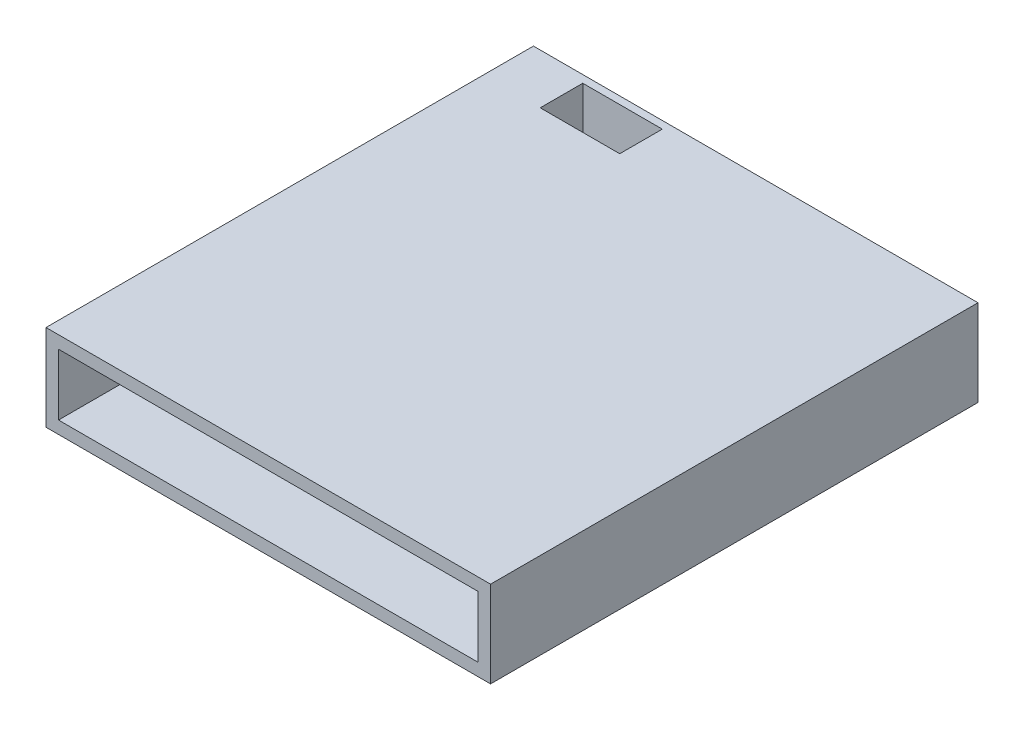
ISO-10303-21;
HEADER;
FILE_DESCRIPTION(('STEP AP214'),'2;1');
FILE_NAME('part.step','',(''),(''),'','','');
FILE_SCHEMA(('AUTOMOTIVE_DESIGN { 1 0 10303 214 1 1 1 1 }'));
ENDSEC;
DATA;
#1=APPLICATION_CONTEXT('core data for automotive mechanical design processes');
#2=APPLICATION_PROTOCOL_DEFINITION('international standard','automotive_design',2000,#1);
#3=PRODUCT_CONTEXT('',#1,'mechanical');
#4=PRODUCT('Part','Part','',(#3));
#5=PRODUCT_RELATED_PRODUCT_CATEGORY('part','',(#4));
#6=PRODUCT_DEFINITION_FORMATION('','',#4);
#7=PRODUCT_DEFINITION_CONTEXT('part definition',#1,'design');
#8=PRODUCT_DEFINITION('design','',#6,#7);
#9=PRODUCT_DEFINITION_SHAPE('','',#8);
#10=(LENGTH_UNIT() NAMED_UNIT(*) SI_UNIT(.MILLI.,.METRE.));
#11=(NAMED_UNIT(*) PLANE_ANGLE_UNIT() SI_UNIT($,.RADIAN.));
#12=(NAMED_UNIT(*) SI_UNIT($,.STERADIAN.) SOLID_ANGLE_UNIT());
#13=UNCERTAINTY_MEASURE_WITH_UNIT(LENGTH_MEASURE(1.E-05),#10,'distance_accuracy_value','');
#14=(GEOMETRIC_REPRESENTATION_CONTEXT(3) GLOBAL_UNCERTAINTY_ASSIGNED_CONTEXT((#13)) GLOBAL_UNIT_ASSIGNED_CONTEXT((#10,
#11,#12)) REPRESENTATION_CONTEXT('',''));
#15=CARTESIAN_POINT('',(0.,0.,0.));
#16=DIRECTION('',(0.,0.,1.));
#17=DIRECTION('',(1.,0.,0.));
#18=AXIS2_PLACEMENT_3D('',#15,#16,#17);
#19=CARTESIAN_POINT('',(-2.25,11.55,0.));
#20=DIRECTION('',(0.,0.,-1.));
#21=DIRECTION('',(-1.,0.,0.));
#22=AXIS2_PLACEMENT_3D('',#19,#20,#21);
#23=PLANE('',#22);
#24=DIRECTION('',(0.,-1.,0.));
#25=VECTOR('',#24,1.);
#26=CARTESIAN_POINT('',(6.83,11.9163239908033,0.));
#27=LINE('',#26,#25);
#28=CARTESIAN_POINT('',(6.83,9.55,0.));
#29=VERTEX_POINT('',#28);
#30=CARTESIAN_POINT('',(6.83,2.06,0.));
#31=VERTEX_POINT('',#30);
#32=EDGE_CURVE('E168',#29,#31,#27,.T.);
#33=ORIENTED_EDGE('',*,*,#32,.F.);
#34=DIRECTION('',(-1.,0.,0.));
#35=VECTOR('',#34,1.);
#36=CARTESIAN_POINT('',(-0.25,9.55,0.));
#37=LINE('',#36,#35);
#38=CARTESIAN_POINT('',(-0.25,9.55,0.));
#39=VERTEX_POINT('',#38);
#40=EDGE_CURVE('E216',#29,#39,#37,.T.);
#41=ORIENTED_EDGE('',*,*,#40,.T.);
#42=DIRECTION('',(0.,-1.,0.));
#43=VECTOR('',#42,1.);
#44=CARTESIAN_POINT('',(-0.25,-0.25,0.));
#45=LINE('',#44,#43);
#46=CARTESIAN_POINT('',(-0.25,-0.25,0.));
#47=VERTEX_POINT('',#46);
#48=EDGE_CURVE('E196',#39,#47,#45,.T.);
#49=ORIENTED_EDGE('',*,*,#48,.T.);
#50=DIRECTION('',(1.,0.,0.));
#51=VECTOR('',#50,1.);
#52=CARTESIAN_POINT('',(-0.25,-0.25,0.));
#53=LINE('',#52,#51);
#54=CARTESIAN_POINT('',(66.75,-0.25,0.));
#55=VERTEX_POINT('',#54);
#56=EDGE_CURVE('E210',#47,#55,#53,.T.);
#57=ORIENTED_EDGE('',*,*,#56,.T.);
#58=DIRECTION('',(0.,1.,0.));
#59=VECTOR('',#58,1.);
#60=CARTESIAN_POINT('',(66.75,-0.25,0.));
#61=LINE('',#60,#59);
#62=CARTESIAN_POINT('',(66.75,9.55,0.));
#63=VERTEX_POINT('',#62);
#64=EDGE_CURVE('E213',#55,#63,#61,.T.);
#65=ORIENTED_EDGE('',*,*,#64,.T.);
#66=CARTESIAN_POINT('',(19.5300000000045,9.55,0.));
#67=VERTEX_POINT('',#66);
#68=EDGE_CURVE('E200',#63,#67,#37,.T.);
#69=ORIENTED_EDGE('',*,*,#68,.T.);
#70=DIRECTION('',(0.,1.,0.));
#71=VECTOR('',#70,1.);
#72=CARTESIAN_POINT('',(19.5300000000045,11.9163239908033,0.));
#73=LINE('',#72,#71);
#74=CARTESIAN_POINT('',(19.5300000000045,2.06,0.));
#75=VERTEX_POINT('',#74);
#76=EDGE_CURVE('E163',#75,#67,#73,.T.);
#77=ORIENTED_EDGE('',*,*,#76,.F.);
#78=DIRECTION('',(1.,0.,0.));
#79=VECTOR('',#78,1.);
#80=CARTESIAN_POINT('',(6.83,2.06,0.));
#81=LINE('',#80,#79);
#82=EDGE_CURVE('E74',#31,#75,#81,.T.);
#83=ORIENTED_EDGE('',*,*,#82,.F.);
#84=EDGE_LOOP('',(#33,#41,#49,#57,#65,#69,#77,#83));
#85=FACE_BOUND('',#84,.T.);
#86=ADVANCED_FACE('F59',(#85),#23,.F.);
#87=CARTESIAN_POINT('',(0.,11.55,69.85));
#88=DIRECTION('',(0.,-1.,0.));
#89=DIRECTION('',(0.,0.,-1.));
#90=AXIS2_PLACEMENT_3D('',#87,#88,#89);
#91=PLANE('',#90);
#92=DIRECTION('',(0.,0.,-1.));
#93=VECTOR('',#92,1.);
#94=CARTESIAN_POINT('',(68.75,11.55,69.85));
#95=LINE('',#94,#93);
#96=CARTESIAN_POINT('',(68.75,11.55,69.85));
#97=VERTEX_POINT('',#96);
#98=CARTESIAN_POINT('',(68.75,11.55,-8.));
#99=VERTEX_POINT('',#98);
#100=EDGE_CURVE('E239',#97,#99,#95,.T.);
#101=ORIENTED_EDGE('',*,*,#100,.T.);
#102=DIRECTION('',(-1.,0.,0.));
#103=VECTOR('',#102,1.);
#104=CARTESIAN_POINT('',(-2.25,11.55,-8.));
#105=LINE('',#104,#103);
#106=CARTESIAN_POINT('',(-2.25,11.55,-8.));
#107=VERTEX_POINT('',#106);
#108=EDGE_CURVE('E187',#99,#107,#105,.T.);
#109=ORIENTED_EDGE('',*,*,#108,.T.);
#110=DIRECTION('',(0.,0.,-1.));
#111=VECTOR('',#110,1.);
#112=CARTESIAN_POINT('',(-2.25,11.55,69.85));
#113=LINE('',#112,#111);
#114=CARTESIAN_POINT('',(-2.25,11.55,69.85));
#115=VERTEX_POINT('',#114);
#116=EDGE_CURVE('E237',#115,#107,#113,.T.);
#117=ORIENTED_EDGE('',*,*,#116,.F.);
#118=DIRECTION('',(-1.,0.,0.));
#119=VECTOR('',#118,1.);
#120=CARTESIAN_POINT('',(0.,11.55,69.85));
#121=LINE('',#120,#119);
#122=EDGE_CURVE('E235',#97,#115,#121,.T.);
#123=ORIENTED_EDGE('',*,*,#122,.F.);
#124=EDGE_LOOP('',(#101,#109,#117,#123));
#125=FACE_BOUND('',#124,.T.);
#126=DIRECTION('',(-1.,0.,0.));
#127=VECTOR('',#126,1.);
#128=CARTESIAN_POINT('',(0.,11.55,-6.8));
#129=LINE('',#128,#127);
#130=CARTESIAN_POINT('',(19.5300000000045,11.55,-6.8));
#131=VERTEX_POINT('',#130);
#132=CARTESIAN_POINT('',(6.83,11.55,-6.8));
#133=VERTEX_POINT('',#132);
#134=EDGE_CURVE('E12',#131,#133,#129,.T.);
#135=ORIENTED_EDGE('',*,*,#134,.F.);
#136=DIRECTION('',(0.,0.,1.));
#137=VECTOR('',#136,1.);
#138=CARTESIAN_POINT('',(19.5300000000045,11.55,69.85));
#139=LINE('',#138,#137);
#140=CARTESIAN_POINT('',(19.5300000000045,11.55,0.));
#141=VERTEX_POINT('',#140);
#142=EDGE_CURVE('E248',#131,#141,#139,.T.);
#143=ORIENTED_EDGE('',*,*,#142,.T.);
#144=DIRECTION('',(-1.,0.,0.));
#145=VECTOR('',#144,1.);
#146=CARTESIAN_POINT('',(0.,11.55,0.));
#147=LINE('',#146,#145);
#148=CARTESIAN_POINT('',(6.83,11.55,0.));
#149=VERTEX_POINT('',#148);
#150=EDGE_CURVE('E245',#141,#149,#147,.T.);
#151=ORIENTED_EDGE('',*,*,#150,.T.);
#152=DIRECTION('',(0.,0.,-1.));
#153=VECTOR('',#152,1.);
#154=CARTESIAN_POINT('',(6.83,11.55,69.85));
#155=LINE('',#154,#153);
#156=EDGE_CURVE('E67',#149,#133,#155,.T.);
#157=ORIENTED_EDGE('',*,*,#156,.T.);
#158=EDGE_LOOP('',(#135,#143,#151,#157));
#159=FACE_BOUND('',#158,.T.);
#160=ADVANCED_FACE('F251',(#125,#159),#91,.F.);
#161=CARTESIAN_POINT('',(0.,0.,69.85));
#162=DIRECTION('',(0.,0.,1.));
#163=DIRECTION('',(1.,0.,0.));
#164=AXIS2_PLACEMENT_3D('',#161,#162,#163);
#165=PLANE('',#164);
#166=DIRECTION('',(0.,-1.,0.));
#167=VECTOR('',#166,1.);
#168=CARTESIAN_POINT('',(-2.25,0.,69.85));
#169=LINE('',#168,#167);
#170=CARTESIAN_POINT('',(-2.25,-2.25,69.85));
#171=VERTEX_POINT('',#170);
#172=EDGE_CURVE('E228',#115,#171,#169,.T.);
#173=ORIENTED_EDGE('',*,*,#172,.T.);
#174=DIRECTION('',(1.,0.,0.));
#175=VECTOR('',#174,1.);
#176=CARTESIAN_POINT('',(0.,-2.25,69.85));
#177=LINE('',#176,#175);
#178=CARTESIAN_POINT('',(68.75,-2.25,69.85));
#179=VERTEX_POINT('',#178);
#180=EDGE_CURVE('E231',#171,#179,#177,.T.);
#181=ORIENTED_EDGE('',*,*,#180,.T.);
#182=DIRECTION('',(0.,1.,0.));
#183=VECTOR('',#182,1.);
#184=CARTESIAN_POINT('',(68.75,0.,69.85));
#185=LINE('',#184,#183);
#186=EDGE_CURVE('E233',#179,#97,#185,.T.);
#187=ORIENTED_EDGE('',*,*,#186,.T.);
#188=ORIENTED_EDGE('',*,*,#122,.T.);
#189=EDGE_LOOP('',(#173,#181,#187,#188));
#190=FACE_BOUND('',#189,.T.);
#191=DIRECTION('',(1.,0.,0.));
#192=VECTOR('',#191,1.);
#193=CARTESIAN_POINT('',(-0.25,-0.25,69.85));
#194=LINE('',#193,#192);
#195=CARTESIAN_POINT('',(-0.25,-0.25,69.85));
#196=VERTEX_POINT('',#195);
#197=CARTESIAN_POINT('',(66.75,-0.25,69.85));
#198=VERTEX_POINT('',#197);
#199=EDGE_CURVE('E199',#196,#198,#194,.T.);
#200=ORIENTED_EDGE('',*,*,#199,.F.);
#201=DIRECTION('',(0.,-1.,0.));
#202=VECTOR('',#201,1.);
#203=CARTESIAN_POINT('',(-0.25,-0.25,69.85));
#204=LINE('',#203,#202);
#205=CARTESIAN_POINT('',(-0.25,9.55,69.85));
#206=VERTEX_POINT('',#205);
#207=EDGE_CURVE('E197',#206,#196,#204,.T.);
#208=ORIENTED_EDGE('',*,*,#207,.F.);
#209=DIRECTION('',(-1.,0.,0.));
#210=VECTOR('',#209,1.);
#211=CARTESIAN_POINT('',(-0.25,9.55,69.85));
#212=LINE('',#211,#210);
#213=CARTESIAN_POINT('',(66.75,9.55,69.85));
#214=VERTEX_POINT('',#213);
#215=EDGE_CURVE('E205',#214,#206,#212,.T.);
#216=ORIENTED_EDGE('',*,*,#215,.F.);
#217=DIRECTION('',(0.,1.,0.));
#218=VECTOR('',#217,1.);
#219=CARTESIAN_POINT('',(66.75,-0.25,69.85));
#220=LINE('',#219,#218);
#221=EDGE_CURVE('E202',#198,#214,#220,.T.);
#222=ORIENTED_EDGE('',*,*,#221,.F.);
#223=EDGE_LOOP('',(#200,#208,#216,#222));
#224=FACE_BOUND('',#223,.T.);
#225=ADVANCED_FACE('F274',(#190,#224),#165,.T.);
#226=CARTESIAN_POINT('',(-2.25,0.,69.85));
#227=DIRECTION('',(1.,0.,0.));
#228=DIRECTION('',(0.,0.,-1.));
#229=AXIS2_PLACEMENT_3D('',#226,#227,#228);
#230=PLANE('',#229);
#231=ORIENTED_EDGE('',*,*,#116,.T.);
#232=DIRECTION('',(0.,-1.,0.));
#233=VECTOR('',#232,1.);
#234=CARTESIAN_POINT('',(-2.25,11.55,-8.));
#235=LINE('',#234,#233);
#236=CARTESIAN_POINT('',(-2.25,-2.25,-8.));
#237=VERTEX_POINT('',#236);
#238=EDGE_CURVE('E190',#107,#237,#235,.T.);
#239=ORIENTED_EDGE('',*,*,#238,.T.);
#240=DIRECTION('',(0.,0.,-1.));
#241=VECTOR('',#240,1.);
#242=CARTESIAN_POINT('',(-2.25,-2.25,69.85));
#243=LINE('',#242,#241);
#244=EDGE_CURVE('E243',#171,#237,#243,.T.);
#245=ORIENTED_EDGE('',*,*,#244,.F.);
#246=ORIENTED_EDGE('',*,*,#172,.F.);
#247=EDGE_LOOP('',(#231,#239,#245,#246));
#248=FACE_BOUND('',#247,.T.);
#249=ADVANCED_FACE('F61',(#248),#230,.F.);
#250=CARTESIAN_POINT('',(0.,-2.25,69.85));
#251=DIRECTION('',(0.,1.,0.));
#252=DIRECTION('',(0.,0.,1.));
#253=AXIS2_PLACEMENT_3D('',#250,#251,#252);
#254=PLANE('',#253);
#255=ORIENTED_EDGE('',*,*,#244,.T.);
#256=DIRECTION('',(-1.,0.,0.));
#257=VECTOR('',#256,1.);
#258=CARTESIAN_POINT('',(-2.25,-2.25,-8.));
#259=LINE('',#258,#257);
#260=CARTESIAN_POINT('',(68.75,-2.25,-8.));
#261=VERTEX_POINT('',#260);
#262=EDGE_CURVE('E184',#261,#237,#259,.T.);
#263=ORIENTED_EDGE('',*,*,#262,.F.);
#264=DIRECTION('',(0.,0.,-1.));
#265=VECTOR('',#264,1.);
#266=CARTESIAN_POINT('',(68.75,-2.25,69.85));
#267=LINE('',#266,#265);
#268=EDGE_CURVE('E241',#179,#261,#267,.T.);
#269=ORIENTED_EDGE('',*,*,#268,.F.);
#270=ORIENTED_EDGE('',*,*,#180,.F.);
#271=EDGE_LOOP('',(#255,#263,#269,#270));
#272=FACE_BOUND('',#271,.T.);
#273=ADVANCED_FACE('F316',(#272),#254,.F.);
#274=CARTESIAN_POINT('',(68.75,0.,69.85));
#275=DIRECTION('',(-1.,0.,0.));
#276=DIRECTION('',(0.,0.,1.));
#277=AXIS2_PLACEMENT_3D('',#274,#275,#276);
#278=PLANE('',#277);
#279=ORIENTED_EDGE('',*,*,#268,.T.);
#280=DIRECTION('',(0.,-1.,0.));
#281=VECTOR('',#280,1.);
#282=CARTESIAN_POINT('',(68.75,11.55,-8.));
#283=LINE('',#282,#281);
#284=EDGE_CURVE('E193',#99,#261,#283,.T.);
#285=ORIENTED_EDGE('',*,*,#284,.F.);
#286=ORIENTED_EDGE('',*,*,#100,.F.);
#287=ORIENTED_EDGE('',*,*,#186,.F.);
#288=EDGE_LOOP('',(#279,#285,#286,#287));
#289=FACE_BOUND('',#288,.T.);
#290=ADVANCED_FACE('F287',(#289),#278,.F.);
#291=CARTESIAN_POINT('',(-0.25,-0.25,69.85));
#292=DIRECTION('',(1.,0.,0.));
#293=DIRECTION('',(0.,0.,-1.));
#294=AXIS2_PLACEMENT_3D('',#291,#292,#293);
#295=PLANE('',#294);
#296=ORIENTED_EDGE('',*,*,#48,.F.);
#297=DIRECTION('',(0.,0.,-1.));
#298=VECTOR('',#297,1.);
#299=CARTESIAN_POINT('',(-0.25,9.55,69.85));
#300=LINE('',#299,#298);
#301=EDGE_CURVE('E207',#206,#39,#300,.T.);
#302=ORIENTED_EDGE('',*,*,#301,.F.);
#303=ORIENTED_EDGE('',*,*,#207,.T.);
#304=DIRECTION('',(0.,0.,-1.));
#305=VECTOR('',#304,1.);
#306=CARTESIAN_POINT('',(-0.25,-0.25,69.85));
#307=LINE('',#306,#305);
#308=EDGE_CURVE('E225',#196,#47,#307,.T.);
#309=ORIENTED_EDGE('',*,*,#308,.T.);
#310=EDGE_LOOP('',(#296,#302,#303,#309));
#311=FACE_BOUND('',#310,.T.);
#312=ADVANCED_FACE('F277',(#311),#295,.T.);
#313=CARTESIAN_POINT('',(-0.25,-0.25,69.85));
#314=DIRECTION('',(0.,1.,0.));
#315=DIRECTION('',(0.,0.,1.));
#316=AXIS2_PLACEMENT_3D('',#313,#314,#315);
#317=PLANE('',#316);
#318=ORIENTED_EDGE('',*,*,#56,.F.);
#319=ORIENTED_EDGE('',*,*,#308,.F.);
#320=ORIENTED_EDGE('',*,*,#199,.T.);
#321=DIRECTION('',(0.,0.,-1.));
#322=VECTOR('',#321,1.);
#323=CARTESIAN_POINT('',(66.75,-0.25,69.85));
#324=LINE('',#323,#322);
#325=EDGE_CURVE('E223',#198,#55,#324,.T.);
#326=ORIENTED_EDGE('',*,*,#325,.T.);
#327=EDGE_LOOP('',(#318,#319,#320,#326));
#328=FACE_BOUND('',#327,.T.);
#329=ADVANCED_FACE('F279',(#328),#317,.T.);
#330=CARTESIAN_POINT('',(66.75,-0.25,69.85));
#331=DIRECTION('',(-1.,0.,0.));
#332=DIRECTION('',(0.,0.,1.));
#333=AXIS2_PLACEMENT_3D('',#330,#331,#332);
#334=PLANE('',#333);
#335=ORIENTED_EDGE('',*,*,#64,.F.);
#336=ORIENTED_EDGE('',*,*,#325,.F.);
#337=ORIENTED_EDGE('',*,*,#221,.T.);
#338=DIRECTION('',(0.,0.,-1.));
#339=VECTOR('',#338,1.);
#340=CARTESIAN_POINT('',(66.75,9.55,69.85));
#341=LINE('',#340,#339);
#342=EDGE_CURVE('E221',#214,#63,#341,.T.);
#343=ORIENTED_EDGE('',*,*,#342,.T.);
#344=EDGE_LOOP('',(#335,#336,#337,#343));
#345=FACE_BOUND('',#344,.T.);
#346=ADVANCED_FACE('F270',(#345),#334,.T.);
#347=CARTESIAN_POINT('',(-0.25,9.55,69.85));
#348=DIRECTION('',(0.,-1.,0.));
#349=DIRECTION('',(0.,0.,-1.));
#350=AXIS2_PLACEMENT_3D('',#347,#348,#349);
#351=PLANE('',#350);
#352=ORIENTED_EDGE('',*,*,#68,.F.);
#353=ORIENTED_EDGE('',*,*,#342,.F.);
#354=ORIENTED_EDGE('',*,*,#215,.T.);
#355=ORIENTED_EDGE('',*,*,#301,.T.);
#356=ORIENTED_EDGE('',*,*,#40,.F.);
#357=EDGE_CURVE('E182',#67,#29,#37,.T.);
#358=ORIENTED_EDGE('',*,*,#357,.F.);
#359=EDGE_LOOP('',(#352,#353,#354,#355,#356,#358));
#360=FACE_BOUND('',#359,.T.);
#361=ADVANCED_FACE('F258',(#360),#351,.T.);
#362=CARTESIAN_POINT('',(-2.25,11.55,-8.));
#363=DIRECTION('',(0.,0.,1.));
#364=DIRECTION('',(1.,0.,0.));
#365=AXIS2_PLACEMENT_3D('',#362,#363,#364);
#366=PLANE('',#365);
#367=ORIENTED_EDGE('',*,*,#284,.T.);
#368=ORIENTED_EDGE('',*,*,#262,.T.);
#369=ORIENTED_EDGE('',*,*,#238,.F.);
#370=ORIENTED_EDGE('',*,*,#108,.F.);
#371=EDGE_LOOP('',(#367,#368,#369,#370));
#372=FACE_BOUND('',#371,.T.);
#373=ADVANCED_FACE('F298',(#372),#366,.F.);
#374=CARTESIAN_POINT('',(6.83,11.9163239908033,-6.8));
#375=DIRECTION('',(-1.,0.,0.));
#376=DIRECTION('',(0.,0.,1.));
#377=AXIS2_PLACEMENT_3D('',#374,#375,#376);
#378=PLANE('',#377);
#379=EDGE_CURVE('E82',#149,#29,#27,.T.);
#380=ORIENTED_EDGE('',*,*,#379,.T.);
#381=ORIENTED_EDGE('',*,*,#32,.T.);
#382=DIRECTION('',(0.,0.,1.));
#383=VECTOR('',#382,1.);
#384=CARTESIAN_POINT('',(6.83,2.06,-6.8));
#385=LINE('',#384,#383);
#386=CARTESIAN_POINT('',(6.83,2.06,-6.8));
#387=VERTEX_POINT('',#386);
#388=EDGE_CURVE('E165',#387,#31,#385,.T.);
#389=ORIENTED_EDGE('',*,*,#388,.F.);
#390=DIRECTION('',(0.,-1.,0.));
#391=VECTOR('',#390,1.);
#392=CARTESIAN_POINT('',(6.83,11.9163239908033,-6.8));
#393=LINE('',#392,#391);
#394=EDGE_CURVE('E154',#133,#387,#393,.T.);
#395=ORIENTED_EDGE('',*,*,#394,.F.);
#396=ORIENTED_EDGE('',*,*,#156,.F.);
#397=EDGE_LOOP('',(#380,#381,#389,#395,#396));
#398=FACE_BOUND('',#397,.T.);
#399=ADVANCED_FACE('F166',(#398),#378,.F.);
#400=CARTESIAN_POINT('',(19.5300000000045,11.9163239908033,-6.8));
#401=DIRECTION('',(1.,0.,0.));
#402=DIRECTION('',(0.,0.,-1.));
#403=AXIS2_PLACEMENT_3D('',#400,#401,#402);
#404=PLANE('',#403);
#405=DIRECTION('',(0.,1.,0.));
#406=VECTOR('',#405,1.);
#407=CARTESIAN_POINT('',(19.5300000000045,11.9163239908033,-6.8));
#408=LINE('',#407,#406);
#409=CARTESIAN_POINT('',(19.5300000000045,2.06,-6.8));
#410=VERTEX_POINT('',#409);
#411=EDGE_CURVE('E170',#410,#131,#408,.T.);
#412=ORIENTED_EDGE('',*,*,#411,.F.);
#413=DIRECTION('',(0.,0.,1.));
#414=VECTOR('',#413,1.);
#415=CARTESIAN_POINT('',(19.5300000000045,2.06,-6.8));
#416=LINE('',#415,#414);
#417=EDGE_CURVE('E169',#410,#75,#416,.T.);
#418=ORIENTED_EDGE('',*,*,#417,.T.);
#419=ORIENTED_EDGE('',*,*,#76,.T.);
#420=EDGE_CURVE('E179',#67,#141,#73,.T.);
#421=ORIENTED_EDGE('',*,*,#420,.T.);
#422=ORIENTED_EDGE('',*,*,#142,.F.);
#423=EDGE_LOOP('',(#412,#418,#419,#421,#422));
#424=FACE_BOUND('',#423,.T.);
#425=ADVANCED_FACE('F264',(#424),#404,.F.);
#426=CARTESIAN_POINT('',(0.,0.,-6.8));
#427=DIRECTION('',(0.,0.,1.));
#428=DIRECTION('',(1.,0.,0.));
#429=AXIS2_PLACEMENT_3D('',#426,#427,#428);
#430=PLANE('',#429);
#431=ORIENTED_EDGE('',*,*,#134,.T.);
#432=ORIENTED_EDGE('',*,*,#394,.T.);
#433=DIRECTION('',(1.,0.,0.));
#434=VECTOR('',#433,1.);
#435=CARTESIAN_POINT('',(6.83,2.06,-6.8));
#436=LINE('',#435,#434);
#437=EDGE_CURVE('E159',#387,#410,#436,.T.);
#438=ORIENTED_EDGE('',*,*,#437,.T.);
#439=ORIENTED_EDGE('',*,*,#411,.T.);
#440=EDGE_LOOP('',(#431,#432,#438,#439));
#441=FACE_BOUND('',#440,.T.);
#442=ADVANCED_FACE('F156',(#441),#430,.T.);
#443=CARTESIAN_POINT('',(0.,0.,0.));
#444=DIRECTION('',(0.,0.,1.));
#445=DIRECTION('',(1.,0.,0.));
#446=AXIS2_PLACEMENT_3D('',#443,#444,#445);
#447=PLANE('',#446);
#448=ORIENTED_EDGE('',*,*,#357,.T.);
#449=ORIENTED_EDGE('',*,*,#379,.F.);
#450=ORIENTED_EDGE('',*,*,#150,.F.);
#451=ORIENTED_EDGE('',*,*,#420,.F.);
#452=EDGE_LOOP('',(#448,#449,#450,#451));
#453=FACE_BOUND('',#452,.T.);
#454=ADVANCED_FACE('F261',(#453),#447,.F.);
#455=CARTESIAN_POINT('',(6.83,2.06,-6.8));
#456=DIRECTION('',(0.,-1.,0.));
#457=DIRECTION('',(0.,0.,-1.));
#458=AXIS2_PLACEMENT_3D('',#455,#456,#457);
#459=PLANE('',#458);
#460=ORIENTED_EDGE('',*,*,#82,.T.);
#461=ORIENTED_EDGE('',*,*,#417,.F.);
#462=ORIENTED_EDGE('',*,*,#437,.F.);
#463=ORIENTED_EDGE('',*,*,#388,.T.);
#464=EDGE_LOOP('',(#460,#461,#462,#463));
#465=FACE_BOUND('',#464,.T.);
#466=ADVANCED_FACE('F172',(#465),#459,.F.);
#467=CLOSED_SHELL('',(#86,#160,#225,#249,#273,#290,#312,#329,#346,#361,#373,#399,#425,#442,#454,#466));
#468=MANIFOLD_SOLID_BREP('B2',#467);
#469=ADVANCED_BREP_SHAPE_REPRESENTATION('',(#18,#468),#14);
#470=SHAPE_DEFINITION_REPRESENTATION(#9,#469);
ENDSEC;
END-ISO-10303-21;
